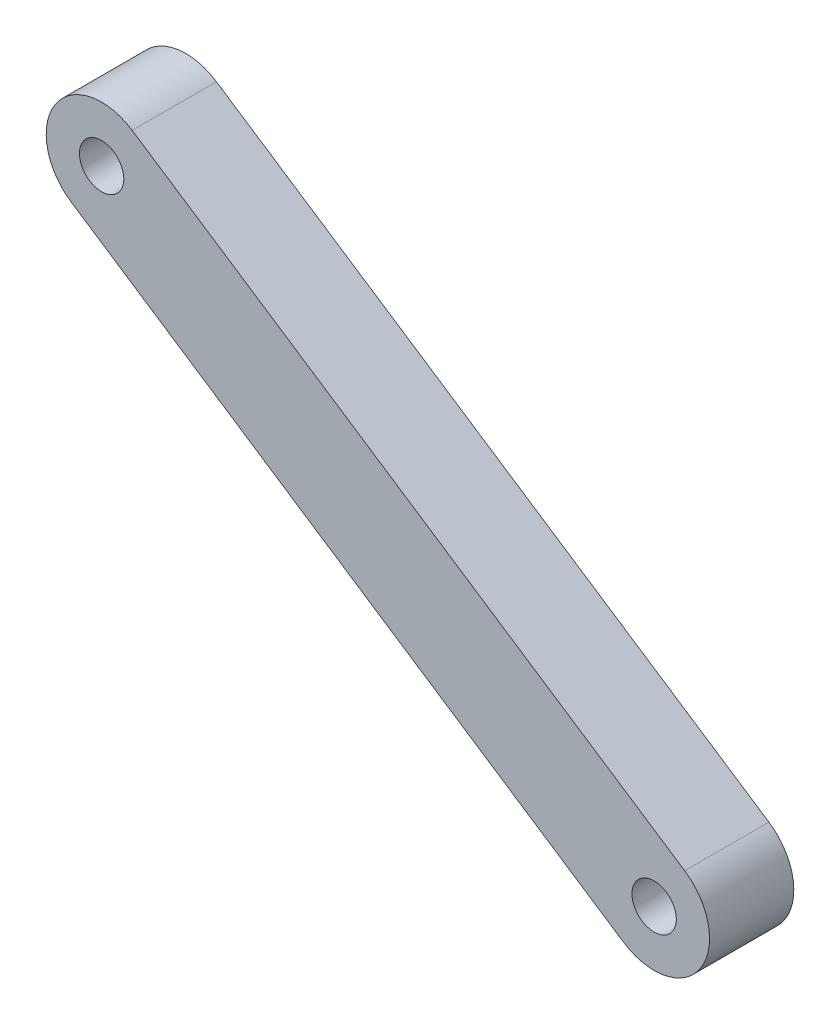
ISO-10303-21;
HEADER;
FILE_DESCRIPTION(('STEP AP214'),'2;1');
FILE_NAME('part.step','',(''),(''),'','','');
FILE_SCHEMA(('AUTOMOTIVE_DESIGN { 1 0 10303 214 1 1 1 1 }'));
ENDSEC;
DATA;
#1=APPLICATION_CONTEXT('core data for automotive mechanical design processes');
#2=APPLICATION_PROTOCOL_DEFINITION('international standard','automotive_design',2000,#1);
#3=PRODUCT_CONTEXT('',#1,'mechanical');
#4=PRODUCT('Part','Part','',(#3));
#5=PRODUCT_RELATED_PRODUCT_CATEGORY('part','',(#4));
#6=PRODUCT_DEFINITION_FORMATION('','',#4);
#7=PRODUCT_DEFINITION_CONTEXT('part definition',#1,'design');
#8=PRODUCT_DEFINITION('design','',#6,#7);
#9=PRODUCT_DEFINITION_SHAPE('','',#8);
#10=(LENGTH_UNIT() NAMED_UNIT(*) SI_UNIT(.MILLI.,.METRE.));
#11=(NAMED_UNIT(*) PLANE_ANGLE_UNIT() SI_UNIT($,.RADIAN.));
#12=(NAMED_UNIT(*) SI_UNIT($,.STERADIAN.) SOLID_ANGLE_UNIT());
#13=UNCERTAINTY_MEASURE_WITH_UNIT(LENGTH_MEASURE(1.E-05),#10,'distance_accuracy_value','');
#14=(GEOMETRIC_REPRESENTATION_CONTEXT(3) GLOBAL_UNCERTAINTY_ASSIGNED_CONTEXT((#13)) GLOBAL_UNIT_ASSIGNED_CONTEXT((#10,
#11,#12)) REPRESENTATION_CONTEXT('',''));
#15=CARTESIAN_POINT('',(0.,0.,0.));
#16=DIRECTION('',(0.,0.,1.));
#17=DIRECTION('',(1.,0.,0.));
#18=AXIS2_PLACEMENT_3D('',#15,#16,#17);
#19=CARTESIAN_POINT('',(-17.1607982938559,49.3028682397159,3.8));
#20=DIRECTION('',(0.,0.,1.));
#21=DIRECTION('',(1.,0.,0.));
#22=AXIS2_PLACEMENT_3D('',#19,#20,#21);
#23=PLANE('',#22);
#24=CARTESIAN_POINT('',(7.76173490593041,32.8408877598814,3.8));
#25=DIRECTION('',(0.,0.,1.));
#26=DIRECTION('',(1.,0.,0.));
#27=AXIS2_PLACEMENT_3D('',#24,#25,#26);
#28=CIRCLE('',#27,1.);
#29=CARTESIAN_POINT('',(6.7617349059304,32.8408877598814,3.8));
#30=VERTEX_POINT('',#29);
#31=EDGE_CURVE('E102',#30,#30,#28,.T.);
#32=ORIENTED_EDGE('',*,*,#31,.F.);
#33=EDGE_LOOP('',(#32));
#34=FACE_BOUND('',#33,.T.);
#35=CARTESIAN_POINT('',(-17.1607982938559,49.3028682397159,3.8));
#36=DIRECTION('',(0.,0.,1.));
#37=DIRECTION('',(1.,0.,0.));
#38=AXIS2_PLACEMENT_3D('',#35,#36,#37);
#39=CIRCLE('',#38,2.5);
#40=CARTESIAN_POINT('',(-15.7829285935526,51.3888871967213,3.8));
#41=VERTEX_POINT('',#40);
#42=CARTESIAN_POINT('',(-18.5386679941592,47.2168492827104,3.8));
#43=VERTEX_POINT('',#42);
#44=EDGE_CURVE('E87',#41,#43,#39,.T.);
#45=ORIENTED_EDGE('',*,*,#44,.T.);
#46=DIRECTION('',(0.834407582802181,-0.551147880121316,0.));
#47=VECTOR('',#46,1.);
#48=CARTESIAN_POINT('',(-18.5386679941592,47.2168492827104,3.8));
#49=LINE('',#48,#47);
#50=CARTESIAN_POINT('',(6.38386520562712,30.754868802876,3.8));
#51=VERTEX_POINT('',#50);
#52=EDGE_CURVE('E82',#43,#51,#49,.T.);
#53=ORIENTED_EDGE('',*,*,#52,.T.);
#54=CARTESIAN_POINT('',(7.76173490593041,32.8408877598814,3.8));
#55=DIRECTION('',(0.,0.,1.));
#56=DIRECTION('',(1.,0.,0.));
#57=AXIS2_PLACEMENT_3D('',#54,#55,#56);
#58=CIRCLE('',#57,2.5);
#59=CARTESIAN_POINT('',(9.1396046062337,34.9269067168869,3.8));
#60=VERTEX_POINT('',#59);
#61=EDGE_CURVE('E85',#51,#60,#58,.T.);
#62=ORIENTED_EDGE('',*,*,#61,.T.);
#63=DIRECTION('',(-0.834407582802181,0.551147880121316,0.));
#64=VECTOR('',#63,1.);
#65=CARTESIAN_POINT('',(-15.7829285935526,51.3888871967213,3.8));
#66=LINE('',#65,#64);
#67=EDGE_CURVE('E52',#60,#41,#66,.T.);
#68=ORIENTED_EDGE('',*,*,#67,.T.);
#69=EDGE_LOOP('',(#45,#53,#62,#68));
#70=FACE_BOUND('',#69,.T.);
#71=CARTESIAN_POINT('',(-17.1607982938559,49.3028682397159,3.8));
#72=DIRECTION('',(0.,0.,1.));
#73=DIRECTION('',(1.,0.,0.));
#74=AXIS2_PLACEMENT_3D('',#71,#72,#73);
#75=CIRCLE('',#74,1.);
#76=CARTESIAN_POINT('',(-18.1607982938559,49.3028682397159,3.8));
#77=VERTEX_POINT('',#76);
#78=EDGE_CURVE('E117',#77,#77,#75,.T.);
#79=ORIENTED_EDGE('',*,*,#78,.F.);
#80=EDGE_LOOP('',(#79));
#81=FACE_BOUND('',#80,.T.);
#82=ADVANCED_FACE('F35',(#34,#70,#81),#23,.T.);
#83=CARTESIAN_POINT('',(-17.1607982938559,49.3028682397159,0.));
#84=DIRECTION('',(0.,0.,1.));
#85=DIRECTION('',(1.,0.,0.));
#86=AXIS2_PLACEMENT_3D('',#83,#84,#85);
#87=PLANE('',#86);
#88=CARTESIAN_POINT('',(-17.1607982938559,49.3028682397159,0.));
#89=DIRECTION('',(0.,0.,1.));
#90=DIRECTION('',(1.,0.,0.));
#91=AXIS2_PLACEMENT_3D('',#88,#89,#90);
#92=CIRCLE('',#91,2.5);
#93=CARTESIAN_POINT('',(-15.7829285935526,51.3888871967213,0.));
#94=VERTEX_POINT('',#93);
#95=CARTESIAN_POINT('',(-18.5386679941592,47.2168492827104,0.));
#96=VERTEX_POINT('',#95);
#97=EDGE_CURVE('E99',#94,#96,#92,.T.);
#98=ORIENTED_EDGE('',*,*,#97,.F.);
#99=DIRECTION('',(-0.834407582802181,0.551147880121316,0.));
#100=VECTOR('',#99,1.);
#101=CARTESIAN_POINT('',(-15.7829285935526,51.3888871967213,0.));
#102=LINE('',#101,#100);
#103=CARTESIAN_POINT('',(9.1396046062337,34.9269067168869,0.));
#104=VERTEX_POINT('',#103);
#105=EDGE_CURVE('E75',#104,#94,#102,.T.);
#106=ORIENTED_EDGE('',*,*,#105,.F.);
#107=CARTESIAN_POINT('',(7.76173490593041,32.8408877598814,0.));
#108=DIRECTION('',(0.,0.,1.));
#109=DIRECTION('',(1.,0.,0.));
#110=AXIS2_PLACEMENT_3D('',#107,#108,#109);
#111=CIRCLE('',#110,2.5);
#112=CARTESIAN_POINT('',(6.38386520562712,30.754868802876,0.));
#113=VERTEX_POINT('',#112);
#114=EDGE_CURVE('E69',#113,#104,#111,.T.);
#115=ORIENTED_EDGE('',*,*,#114,.F.);
#116=DIRECTION('',(0.834407582802181,-0.551147880121316,0.));
#117=VECTOR('',#116,1.);
#118=CARTESIAN_POINT('',(-18.5386679941592,47.2168492827104,0.));
#119=LINE('',#118,#117);
#120=EDGE_CURVE('E91',#96,#113,#119,.T.);
#121=ORIENTED_EDGE('',*,*,#120,.F.);
#122=EDGE_LOOP('',(#98,#106,#115,#121));
#123=FACE_BOUND('',#122,.T.);
#124=CARTESIAN_POINT('',(7.76173490593041,32.8408877598814,0.));
#125=DIRECTION('',(0.,0.,1.));
#126=DIRECTION('',(1.,0.,0.));
#127=AXIS2_PLACEMENT_3D('',#124,#125,#126);
#128=CIRCLE('',#127,1.);
#129=CARTESIAN_POINT('',(6.7617349059304,32.8408877598814,0.));
#130=VERTEX_POINT('',#129);
#131=EDGE_CURVE('E114',#130,#130,#128,.T.);
#132=ORIENTED_EDGE('',*,*,#131,.T.);
#133=EDGE_LOOP('',(#132));
#134=FACE_BOUND('',#133,.T.);
#135=CARTESIAN_POINT('',(-17.1607982938559,49.3028682397159,0.));
#136=DIRECTION('',(0.,0.,1.));
#137=DIRECTION('',(1.,0.,0.));
#138=AXIS2_PLACEMENT_3D('',#135,#136,#137);
#139=CIRCLE('',#138,1.);
#140=CARTESIAN_POINT('',(-18.1607982938559,49.3028682397159,0.));
#141=VERTEX_POINT('',#140);
#142=EDGE_CURVE('E120',#141,#141,#139,.T.);
#143=ORIENTED_EDGE('',*,*,#142,.T.);
#144=EDGE_LOOP('',(#143));
#145=FACE_BOUND('',#144,.T.);
#146=ADVANCED_FACE('F110',(#123,#134,#145),#87,.F.);
#147=CARTESIAN_POINT('',(-17.1607982938559,49.3028682397159,3.8));
#148=DIRECTION('',(0.,0.,-1.));
#149=DIRECTION('',(-1.,0.,0.));
#150=AXIS2_PLACEMENT_3D('',#147,#148,#149);
#151=CYLINDRICAL_SURFACE('',#150,2.5);
#152=ORIENTED_EDGE('',*,*,#97,.T.);
#153=DIRECTION('',(0.,0.,-1.));
#154=VECTOR('',#153,1.);
#155=CARTESIAN_POINT('',(-18.5386679941592,47.2168492827104,3.8));
#156=LINE('',#155,#154);
#157=EDGE_CURVE('E11',#43,#96,#156,.T.);
#158=ORIENTED_EDGE('',*,*,#157,.F.);
#159=ORIENTED_EDGE('',*,*,#44,.F.);
#160=DIRECTION('',(0.,0.,-1.));
#161=VECTOR('',#160,1.);
#162=CARTESIAN_POINT('',(-15.7829285935526,51.3888871967213,3.8));
#163=LINE('',#162,#161);
#164=EDGE_CURVE('E95',#41,#94,#163,.T.);
#165=ORIENTED_EDGE('',*,*,#164,.T.);
#166=EDGE_LOOP('',(#152,#158,#159,#165));
#167=FACE_BOUND('',#166,.T.);
#168=ADVANCED_FACE('F37',(#167),#151,.T.);
#169=CARTESIAN_POINT('',(-18.5386679941592,47.2168492827104,3.8));
#170=DIRECTION('',(0.551147880121316,0.834407582802181,0.));
#171=DIRECTION('',(-0.834407582802182,0.551147880121316,0.));
#172=AXIS2_PLACEMENT_3D('',#169,#170,#171);
#173=PLANE('',#172);
#174=ORIENTED_EDGE('',*,*,#120,.T.);
#175=DIRECTION('',(0.,0.,-1.));
#176=VECTOR('',#175,1.);
#177=CARTESIAN_POINT('',(6.38386520562712,30.754868802876,3.8));
#178=LINE('',#177,#176);
#179=EDGE_CURVE('E44',#51,#113,#178,.T.);
#180=ORIENTED_EDGE('',*,*,#179,.F.);
#181=ORIENTED_EDGE('',*,*,#52,.F.);
#182=ORIENTED_EDGE('',*,*,#157,.T.);
#183=EDGE_LOOP('',(#174,#180,#181,#182));
#184=FACE_BOUND('',#183,.T.);
#185=ADVANCED_FACE('F90',(#184),#173,.F.);
#186=CARTESIAN_POINT('',(7.76173490593041,32.8408877598814,3.8));
#187=DIRECTION('',(0.,0.,-1.));
#188=DIRECTION('',(-1.,0.,0.));
#189=AXIS2_PLACEMENT_3D('',#186,#187,#188);
#190=CYLINDRICAL_SURFACE('',#189,2.5);
#191=ORIENTED_EDGE('',*,*,#114,.T.);
#192=DIRECTION('',(0.,0.,-1.));
#193=VECTOR('',#192,1.);
#194=CARTESIAN_POINT('',(9.1396046062337,34.9269067168869,3.8));
#195=LINE('',#194,#193);
#196=EDGE_CURVE('E92',#60,#104,#195,.T.);
#197=ORIENTED_EDGE('',*,*,#196,.F.);
#198=ORIENTED_EDGE('',*,*,#61,.F.);
#199=ORIENTED_EDGE('',*,*,#179,.T.);
#200=EDGE_LOOP('',(#191,#197,#198,#199));
#201=FACE_BOUND('',#200,.T.);
#202=ADVANCED_FACE('F93',(#201),#190,.T.);
#203=CARTESIAN_POINT('',(-15.7829285935526,51.3888871967213,3.8));
#204=DIRECTION('',(-0.551147880121316,-0.834407582802181,0.));
#205=DIRECTION('',(0.834407582802181,-0.551147880121316,0.));
#206=AXIS2_PLACEMENT_3D('',#203,#204,#205);
#207=PLANE('',#206);
#208=ORIENTED_EDGE('',*,*,#105,.T.);
#209=ORIENTED_EDGE('',*,*,#164,.F.);
#210=ORIENTED_EDGE('',*,*,#67,.F.);
#211=ORIENTED_EDGE('',*,*,#196,.T.);
#212=EDGE_LOOP('',(#208,#209,#210,#211));
#213=FACE_BOUND('',#212,.T.);
#214=ADVANCED_FACE('F107',(#213),#207,.F.);
#215=CARTESIAN_POINT('',(7.76173490593041,32.8408877598814,3.8));
#216=DIRECTION('',(0.,0.,-1.));
#217=DIRECTION('',(-1.,0.,0.));
#218=AXIS2_PLACEMENT_3D('',#215,#216,#217);
#219=CYLINDRICAL_SURFACE('',#218,1.);
#220=CARTESIAN_POINT('',(6.7617349059304,32.8408877598814,3.8));
#221=CARTESIAN_POINT('',(6.7617349059304,32.8408877598814,3.76041666666667));
#222=CARTESIAN_POINT('',(6.7617349059304,32.8408877598814,3.72083333333333));
#223=CARTESIAN_POINT('',(6.7617349059304,32.8408877598814,3.64166666666667));
#224=CARTESIAN_POINT('',(6.7617349059304,32.8408877598814,3.60208333333333));
#225=CARTESIAN_POINT('',(6.7617349059304,32.8408877598814,3.52291666666667));
#226=CARTESIAN_POINT('',(6.7617349059304,32.8408877598814,3.48333333333333));
#227=CARTESIAN_POINT('',(6.7617349059304,32.8408877598814,3.40416666666667));
#228=CARTESIAN_POINT('',(6.7617349059304,32.8408877598814,3.36458333333333));
#229=CARTESIAN_POINT('',(6.7617349059304,32.8408877598814,3.28541666666667));
#230=CARTESIAN_POINT('',(6.7617349059304,32.8408877598814,3.24583333333333));
#231=CARTESIAN_POINT('',(6.7617349059304,32.8408877598814,3.16666666666667));
#232=CARTESIAN_POINT('',(6.7617349059304,32.8408877598814,3.12708333333333));
#233=CARTESIAN_POINT('',(6.7617349059304,32.8408877598814,3.04791666666667));
#234=CARTESIAN_POINT('',(6.7617349059304,32.8408877598814,3.00833333333333));
#235=CARTESIAN_POINT('',(6.7617349059304,32.8408877598814,2.92916666666667));
#236=CARTESIAN_POINT('',(6.7617349059304,32.8408877598814,2.88958333333333));
#237=CARTESIAN_POINT('',(6.7617349059304,32.8408877598814,2.81041666666667));
#238=CARTESIAN_POINT('',(6.7617349059304,32.8408877598814,2.77083333333333));
#239=CARTESIAN_POINT('',(6.7617349059304,32.8408877598814,2.69166666666667));
#240=CARTESIAN_POINT('',(6.7617349059304,32.8408877598814,2.65208333333333));
#241=CARTESIAN_POINT('',(6.7617349059304,32.8408877598814,2.57291666666667));
#242=CARTESIAN_POINT('',(6.7617349059304,32.8408877598814,2.53333333333333));
#243=CARTESIAN_POINT('',(6.7617349059304,32.8408877598814,2.45416666666667));
#244=CARTESIAN_POINT('',(6.7617349059304,32.8408877598814,2.41458333333333));
#245=CARTESIAN_POINT('',(6.7617349059304,32.8408877598814,2.33541666666667));
#246=CARTESIAN_POINT('',(6.7617349059304,32.8408877598814,2.29583333333333));
#247=CARTESIAN_POINT('',(6.7617349059304,32.8408877598814,2.21666666666667));
#248=CARTESIAN_POINT('',(6.7617349059304,32.8408877598814,2.17708333333333));
#249=CARTESIAN_POINT('',(6.7617349059304,32.8408877598814,2.09791666666667));
#250=CARTESIAN_POINT('',(6.7617349059304,32.8408877598814,2.05833333333333));
#251=CARTESIAN_POINT('',(6.7617349059304,32.8408877598814,1.97916666666667));
#252=CARTESIAN_POINT('',(6.7617349059304,32.8408877598814,1.93958333333333));
#253=CARTESIAN_POINT('',(6.7617349059304,32.8408877598814,1.86041666666667));
#254=CARTESIAN_POINT('',(6.7617349059304,32.8408877598814,1.82083333333333));
#255=CARTESIAN_POINT('',(6.7617349059304,32.8408877598814,1.74166666666667));
#256=CARTESIAN_POINT('',(6.7617349059304,32.8408877598814,1.70208333333333));
#257=CARTESIAN_POINT('',(6.7617349059304,32.8408877598814,1.62291666666667));
#258=CARTESIAN_POINT('',(6.7617349059304,32.8408877598814,1.58333333333333));
#259=CARTESIAN_POINT('',(6.7617349059304,32.8408877598814,1.50416666666667));
#260=CARTESIAN_POINT('',(6.7617349059304,32.8408877598814,1.46458333333333));
#261=CARTESIAN_POINT('',(6.7617349059304,32.8408877598814,1.38541666666667));
#262=CARTESIAN_POINT('',(6.7617349059304,32.8408877598814,1.34583333333333));
#263=CARTESIAN_POINT('',(6.7617349059304,32.8408877598814,1.26666666666667));
#264=CARTESIAN_POINT('',(6.7617349059304,32.8408877598814,1.22708333333333));
#265=CARTESIAN_POINT('',(6.7617349059304,32.8408877598814,1.14791666666667));
#266=CARTESIAN_POINT('',(6.7617349059304,32.8408877598814,1.10833333333333));
#267=CARTESIAN_POINT('',(6.7617349059304,32.8408877598814,1.02916666666667));
#268=CARTESIAN_POINT('',(6.7617349059304,32.8408877598814,0.989583333333333));
#269=CARTESIAN_POINT('',(6.7617349059304,32.8408877598814,0.910416666666667));
#270=CARTESIAN_POINT('',(6.7617349059304,32.8408877598814,0.870833333333333));
#271=CARTESIAN_POINT('',(6.7617349059304,32.8408877598814,0.791666666666667));
#272=CARTESIAN_POINT('',(6.7617349059304,32.8408877598814,0.752083333333333));
#273=CARTESIAN_POINT('',(6.7617349059304,32.8408877598814,0.672916666666667));
#274=CARTESIAN_POINT('',(6.7617349059304,32.8408877598814,0.633333333333333));
#275=CARTESIAN_POINT('',(6.7617349059304,32.8408877598814,0.554166666666667));
#276=CARTESIAN_POINT('',(6.7617349059304,32.8408877598814,0.514583333333334));
#277=CARTESIAN_POINT('',(6.7617349059304,32.8408877598814,0.435416666666667));
#278=CARTESIAN_POINT('',(6.7617349059304,32.8408877598814,0.395833333333333));
#279=CARTESIAN_POINT('',(6.7617349059304,32.8408877598814,0.316666666666666));
#280=CARTESIAN_POINT('',(6.7617349059304,32.8408877598814,0.277083333333333));
#281=CARTESIAN_POINT('',(6.7617349059304,32.8408877598814,0.197916666666667));
#282=CARTESIAN_POINT('',(6.7617349059304,32.8408877598814,0.158333333333333));
#283=CARTESIAN_POINT('',(6.7617349059304,32.8408877598814,0.0791666666666666));
#284=CARTESIAN_POINT('',(6.7617349059304,32.8408877598814,0.0395833333333333));
#285=CARTESIAN_POINT('',(6.7617349059304,32.8408877598814,0.));
#286=B_SPLINE_CURVE_WITH_KNOTS('',3,(#220,#221,#222,#223,#224,#225,#226,#227,#228,#229,#230,
#231,#232,#233,#234,#235,#236,#237,#238,#239,#240,#241,#242,#243,#244,#245,#246,#247,#248,#249,
#250,#251,#252,#253,#254,#255,#256,#257,#258,#259,#260,#261,#262,#263,#264,#265,#266,#267,#268,
#269,#270,#271,#272,#273,#274,#275,#276,#277,#278,#279,#280,#281,#282,#283,#284,#285),
.UNSPECIFIED.,.F.,.F.,(4,2,2,2,2,2,2,2,2,2,2,2,2,2,2,2,2,2,2,2,2,2,2,2,2,2,2,2,2,2,2,2,4),(0.,
0.11875,0.2375,0.35625,0.475,0.59375,0.7125,0.831249999999999,0.95,1.06875,1.1875,1.30625,1.425,
1.54375,1.6625,1.78125,1.9,2.01875,2.1375,2.25625,2.375,2.49375,2.6125,2.73125,2.85,2.96875,
3.0875,3.20625,3.325,3.44375,3.5625,3.68125,3.8),.UNSPECIFIED.);
#287=EDGE_CURVE('BSEAM137',#30,#130,#286,.T.);
#288=ORIENTED_EDGE('',*,*,#31,.T.);
#289=ORIENTED_EDGE('',*,*,#131,.F.);
#290=ORIENTED_EDGE('',*,*,#287,.T.);
#291=ORIENTED_EDGE('',*,*,#287,.F.);
#292=EDGE_LOOP('',(#288,#290,#289,#291));
#293=FACE_BOUND('',#292,.T.);
#294=ADVANCED_FACE('F137',(#293),#219,.F.);
#295=CARTESIAN_POINT('',(-17.1607982938559,49.3028682397159,3.8));
#296=DIRECTION('',(0.,0.,-1.));
#297=DIRECTION('',(-1.,0.,0.));
#298=AXIS2_PLACEMENT_3D('',#295,#296,#297);
#299=CYLINDRICAL_SURFACE('',#298,1.);
#300=CARTESIAN_POINT('',(-18.1607982938559,49.3028682397159,3.8));
#301=CARTESIAN_POINT('',(-18.1607982938559,49.3028682397159,3.76041666666667));
#302=CARTESIAN_POINT('',(-18.1607982938559,49.3028682397159,3.72083333333333));
#303=CARTESIAN_POINT('',(-18.1607982938559,49.3028682397159,3.64166666666667));
#304=CARTESIAN_POINT('',(-18.1607982938559,49.3028682397159,3.60208333333333));
#305=CARTESIAN_POINT('',(-18.1607982938559,49.3028682397159,3.52291666666667));
#306=CARTESIAN_POINT('',(-18.1607982938559,49.3028682397159,3.48333333333333));
#307=CARTESIAN_POINT('',(-18.1607982938559,49.3028682397159,3.40416666666667));
#308=CARTESIAN_POINT('',(-18.1607982938559,49.3028682397159,3.36458333333333));
#309=CARTESIAN_POINT('',(-18.1607982938559,49.3028682397159,3.28541666666667));
#310=CARTESIAN_POINT('',(-18.1607982938559,49.3028682397159,3.24583333333333));
#311=CARTESIAN_POINT('',(-18.1607982938559,49.3028682397159,3.16666666666667));
#312=CARTESIAN_POINT('',(-18.1607982938559,49.3028682397159,3.12708333333333));
#313=CARTESIAN_POINT('',(-18.1607982938559,49.3028682397159,3.04791666666667));
#314=CARTESIAN_POINT('',(-18.1607982938559,49.3028682397159,3.00833333333333));
#315=CARTESIAN_POINT('',(-18.1607982938559,49.3028682397159,2.92916666666667));
#316=CARTESIAN_POINT('',(-18.1607982938559,49.3028682397159,2.88958333333333));
#317=CARTESIAN_POINT('',(-18.1607982938559,49.3028682397159,2.81041666666667));
#318=CARTESIAN_POINT('',(-18.1607982938559,49.3028682397159,2.77083333333333));
#319=CARTESIAN_POINT('',(-18.1607982938559,49.3028682397159,2.69166666666667));
#320=CARTESIAN_POINT('',(-18.1607982938559,49.3028682397159,2.65208333333333));
#321=CARTESIAN_POINT('',(-18.1607982938559,49.3028682397159,2.57291666666667));
#322=CARTESIAN_POINT('',(-18.1607982938559,49.3028682397159,2.53333333333333));
#323=CARTESIAN_POINT('',(-18.1607982938559,49.3028682397159,2.45416666666667));
#324=CARTESIAN_POINT('',(-18.1607982938559,49.3028682397159,2.41458333333333));
#325=CARTESIAN_POINT('',(-18.1607982938559,49.3028682397159,2.33541666666667));
#326=CARTESIAN_POINT('',(-18.1607982938559,49.3028682397159,2.29583333333333));
#327=CARTESIAN_POINT('',(-18.1607982938559,49.3028682397159,2.21666666666667));
#328=CARTESIAN_POINT('',(-18.1607982938559,49.3028682397159,2.17708333333333));
#329=CARTESIAN_POINT('',(-18.1607982938559,49.3028682397159,2.09791666666667));
#330=CARTESIAN_POINT('',(-18.1607982938559,49.3028682397159,2.05833333333333));
#331=CARTESIAN_POINT('',(-18.1607982938559,49.3028682397159,1.97916666666667));
#332=CARTESIAN_POINT('',(-18.1607982938559,49.3028682397159,1.93958333333333));
#333=CARTESIAN_POINT('',(-18.1607982938559,49.3028682397159,1.86041666666667));
#334=CARTESIAN_POINT('',(-18.1607982938559,49.3028682397159,1.82083333333333));
#335=CARTESIAN_POINT('',(-18.1607982938559,49.3028682397159,1.74166666666667));
#336=CARTESIAN_POINT('',(-18.1607982938559,49.3028682397159,1.70208333333333));
#337=CARTESIAN_POINT('',(-18.1607982938559,49.3028682397159,1.62291666666667));
#338=CARTESIAN_POINT('',(-18.1607982938559,49.3028682397159,1.58333333333333));
#339=CARTESIAN_POINT('',(-18.1607982938559,49.3028682397159,1.50416666666667));
#340=CARTESIAN_POINT('',(-18.1607982938559,49.3028682397159,1.46458333333333));
#341=CARTESIAN_POINT('',(-18.1607982938559,49.3028682397159,1.38541666666667));
#342=CARTESIAN_POINT('',(-18.1607982938559,49.3028682397159,1.34583333333333));
#343=CARTESIAN_POINT('',(-18.1607982938559,49.3028682397159,1.26666666666667));
#344=CARTESIAN_POINT('',(-18.1607982938559,49.3028682397159,1.22708333333333));
#345=CARTESIAN_POINT('',(-18.1607982938559,49.3028682397159,1.14791666666667));
#346=CARTESIAN_POINT('',(-18.1607982938559,49.3028682397159,1.10833333333333));
#347=CARTESIAN_POINT('',(-18.1607982938559,49.3028682397159,1.02916666666667));
#348=CARTESIAN_POINT('',(-18.1607982938559,49.3028682397159,0.989583333333333));
#349=CARTESIAN_POINT('',(-18.1607982938559,49.3028682397159,0.910416666666667));
#350=CARTESIAN_POINT('',(-18.1607982938559,49.3028682397159,0.870833333333333));
#351=CARTESIAN_POINT('',(-18.1607982938559,49.3028682397159,0.791666666666667));
#352=CARTESIAN_POINT('',(-18.1607982938559,49.3028682397159,0.752083333333333));
#353=CARTESIAN_POINT('',(-18.1607982938559,49.3028682397159,0.672916666666667));
#354=CARTESIAN_POINT('',(-18.1607982938559,49.3028682397159,0.633333333333333));
#355=CARTESIAN_POINT('',(-18.1607982938559,49.3028682397159,0.554166666666667));
#356=CARTESIAN_POINT('',(-18.1607982938559,49.3028682397159,0.514583333333334));
#357=CARTESIAN_POINT('',(-18.1607982938559,49.3028682397159,0.435416666666667));
#358=CARTESIAN_POINT('',(-18.1607982938559,49.3028682397159,0.395833333333333));
#359=CARTESIAN_POINT('',(-18.1607982938559,49.3028682397159,0.316666666666666));
#360=CARTESIAN_POINT('',(-18.1607982938559,49.3028682397159,0.277083333333333));
#361=CARTESIAN_POINT('',(-18.1607982938559,49.3028682397159,0.197916666666667));
#362=CARTESIAN_POINT('',(-18.1607982938559,49.3028682397159,0.158333333333333));
#363=CARTESIAN_POINT('',(-18.1607982938559,49.3028682397159,0.0791666666666666));
#364=CARTESIAN_POINT('',(-18.1607982938559,49.3028682397159,0.0395833333333333));
#365=CARTESIAN_POINT('',(-18.1607982938559,49.3028682397159,0.));
#366=B_SPLINE_CURVE_WITH_KNOTS('',3,(#300,#301,#302,#303,#304,#305,#306,#307,#308,#309,#310,
#311,#312,#313,#314,#315,#316,#317,#318,#319,#320,#321,#322,#323,#324,#325,#326,#327,#328,#329,
#330,#331,#332,#333,#334,#335,#336,#337,#338,#339,#340,#341,#342,#343,#344,#345,#346,#347,#348,
#349,#350,#351,#352,#353,#354,#355,#356,#357,#358,#359,#360,#361,#362,#363,#364,#365),
.UNSPECIFIED.,.F.,.F.,(4,2,2,2,2,2,2,2,2,2,2,2,2,2,2,2,2,2,2,2,2,2,2,2,2,2,2,2,2,2,2,2,4),(0.,
0.11875,0.2375,0.35625,0.475,0.59375,0.7125,0.831249999999999,0.95,1.06875,1.1875,1.30625,1.425,
1.54375,1.6625,1.78125,1.9,2.01875,2.1375,2.25625,2.375,2.49375,2.6125,2.73125,2.85,2.96875,
3.0875,3.20625,3.325,3.44375,3.5625,3.68125,3.8),.UNSPECIFIED.);
#367=EDGE_CURVE('BSEAM126',#77,#141,#366,.T.);
#368=ORIENTED_EDGE('',*,*,#78,.T.);
#369=ORIENTED_EDGE('',*,*,#142,.F.);
#370=ORIENTED_EDGE('',*,*,#367,.T.);
#371=ORIENTED_EDGE('',*,*,#367,.F.);
#372=EDGE_LOOP('',(#368,#370,#369,#371));
#373=FACE_BOUND('',#372,.T.);
#374=ADVANCED_FACE('F126',(#373),#299,.F.);
#375=CLOSED_SHELL('',(#82,#146,#168,#185,#202,#214,#294,#374));
#376=MANIFOLD_SOLID_BREP('B2',#375);
#377=ADVANCED_BREP_SHAPE_REPRESENTATION('',(#18,#376),#14);
#378=SHAPE_DEFINITION_REPRESENTATION(#9,#377);
ENDSEC;
END-ISO-10303-21;
